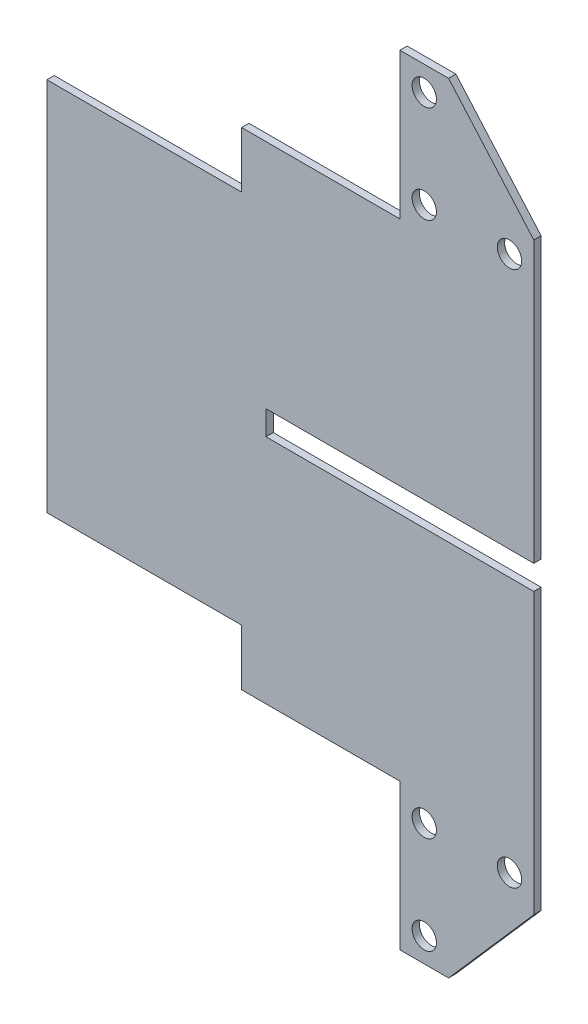
ISO-10303-21;
HEADER;
FILE_DESCRIPTION(('STEP AP214'),'2;1');
FILE_NAME('part.step','',(''),(''),'','','');
FILE_SCHEMA(('AUTOMOTIVE_DESIGN { 1 0 10303 214 1 1 1 1 }'));
ENDSEC;
DATA;
#1=APPLICATION_CONTEXT('core data for automotive mechanical design processes');
#2=APPLICATION_PROTOCOL_DEFINITION('international standard','automotive_design',2000,#1);
#3=PRODUCT_CONTEXT('',#1,'mechanical');
#4=PRODUCT('Part','Part','',(#3));
#5=PRODUCT_RELATED_PRODUCT_CATEGORY('part','',(#4));
#6=PRODUCT_DEFINITION_FORMATION('','',#4);
#7=PRODUCT_DEFINITION_CONTEXT('part definition',#1,'design');
#8=PRODUCT_DEFINITION('design','',#6,#7);
#9=PRODUCT_DEFINITION_SHAPE('','',#8);
#10=(LENGTH_UNIT() NAMED_UNIT(*) SI_UNIT(.MILLI.,.METRE.));
#11=(NAMED_UNIT(*) PLANE_ANGLE_UNIT() SI_UNIT($,.RADIAN.));
#12=(NAMED_UNIT(*) SI_UNIT($,.STERADIAN.) SOLID_ANGLE_UNIT());
#13=UNCERTAINTY_MEASURE_WITH_UNIT(LENGTH_MEASURE(1.E-05),#10,'distance_accuracy_value','');
#14=(GEOMETRIC_REPRESENTATION_CONTEXT(3) GLOBAL_UNCERTAINTY_ASSIGNED_CONTEXT((#13)) GLOBAL_UNIT_ASSIGNED_CONTEXT((#10,
#11,#12)) REPRESENTATION_CONTEXT('',''));
#15=CARTESIAN_POINT('',(0.,0.,0.));
#16=DIRECTION('',(0.,0.,1.));
#17=DIRECTION('',(1.,0.,0.));
#18=AXIS2_PLACEMENT_3D('',#15,#16,#17);
#19=CARTESIAN_POINT('',(0.,100.,3.));
#20=DIRECTION('',(0.,1.,0.));
#21=DIRECTION('',(0.,0.,1.));
#22=AXIS2_PLACEMENT_3D('',#19,#20,#21);
#23=PLANE('',#22);
#24=DIRECTION('',(1.,0.,0.));
#25=VECTOR('',#24,1.);
#26=CARTESIAN_POINT('',(0.,100.,0.));
#27=LINE('',#26,#25);
#28=CARTESIAN_POINT('',(80.,100.,0.));
#29=VERTEX_POINT('',#28);
#30=CARTESIAN_POINT('',(145.,100.,0.));
#31=VERTEX_POINT('',#30);
#32=EDGE_CURVE('E153',#29,#31,#27,.T.);
#33=ORIENTED_EDGE('',*,*,#32,.F.);
#34=DIRECTION('',(0.,0.,-1.));
#35=VECTOR('',#34,1.);
#36=CARTESIAN_POINT('',(80.,100.,3.));
#37=LINE('',#36,#35);
#38=CARTESIAN_POINT('',(80.,100.,3.));
#39=VERTEX_POINT('',#38);
#40=EDGE_CURVE('E11',#39,#29,#37,.T.);
#41=ORIENTED_EDGE('',*,*,#40,.F.);
#42=DIRECTION('',(1.,0.,0.));
#43=VECTOR('',#42,1.);
#44=CARTESIAN_POINT('',(0.,100.,3.));
#45=LINE('',#44,#43);
#46=CARTESIAN_POINT('',(145.,100.,3.));
#47=VERTEX_POINT('',#46);
#48=EDGE_CURVE('E189',#39,#47,#45,.T.);
#49=ORIENTED_EDGE('',*,*,#48,.T.);
#50=DIRECTION('',(0.,0.,-1.));
#51=VECTOR('',#50,1.);
#52=CARTESIAN_POINT('',(145.,100.,3.));
#53=LINE('',#52,#51);
#54=EDGE_CURVE('E53',#47,#31,#53,.T.);
#55=ORIENTED_EDGE('',*,*,#54,.T.);
#56=EDGE_LOOP('',(#33,#41,#49,#55));
#57=FACE_BOUND('',#56,.T.);
#58=ADVANCED_FACE('F37',(#57),#23,.T.);
#59=CARTESIAN_POINT('',(80.,0.,3.));
#60=DIRECTION('',(1.,0.,0.));
#61=DIRECTION('',(0.,0.,-1.));
#62=AXIS2_PLACEMENT_3D('',#59,#60,#61);
#63=PLANE('',#62);
#64=DIRECTION('',(0.,-1.,0.));
#65=VECTOR('',#64,1.);
#66=CARTESIAN_POINT('',(80.,0.,0.));
#67=LINE('',#66,#65);
#68=CARTESIAN_POINT('',(80.,77.,0.));
#69=VERTEX_POINT('',#68);
#70=EDGE_CURVE('E155',#29,#69,#67,.T.);
#71=ORIENTED_EDGE('',*,*,#70,.T.);
#72=DIRECTION('',(0.,0.,-1.));
#73=VECTOR('',#72,1.);
#74=CARTESIAN_POINT('',(80.,77.,3.));
#75=LINE('',#74,#73);
#76=CARTESIAN_POINT('',(80.,77.,3.));
#77=VERTEX_POINT('',#76);
#78=EDGE_CURVE('E45',#77,#69,#75,.T.);
#79=ORIENTED_EDGE('',*,*,#78,.F.);
#80=DIRECTION('',(0.,-1.,0.));
#81=VECTOR('',#80,1.);
#82=CARTESIAN_POINT('',(80.,0.,3.));
#83=LINE('',#82,#81);
#84=EDGE_CURVE('E258',#39,#77,#83,.T.);
#85=ORIENTED_EDGE('',*,*,#84,.F.);
#86=ORIENTED_EDGE('',*,*,#40,.T.);
#87=EDGE_LOOP('',(#71,#79,#85,#86));
#88=FACE_BOUND('',#87,.T.);
#89=ADVANCED_FACE('F207',(#88),#63,.F.);
#90=CARTESIAN_POINT('',(0.,77.,3.));
#91=DIRECTION('',(0.,1.,0.));
#92=DIRECTION('',(0.,0.,1.));
#93=AXIS2_PLACEMENT_3D('',#90,#91,#92);
#94=PLANE('',#93);
#95=DIRECTION('',(1.,0.,0.));
#96=VECTOR('',#95,1.);
#97=CARTESIAN_POINT('',(0.,77.,0.));
#98=LINE('',#97,#96);
#99=CARTESIAN_POINT('',(0.,77.,0.));
#100=VERTEX_POINT('',#99);
#101=EDGE_CURVE('E159',#100,#69,#98,.T.);
#102=ORIENTED_EDGE('',*,*,#101,.F.);
#103=DIRECTION('',(0.,0.,-1.));
#104=VECTOR('',#103,1.);
#105=CARTESIAN_POINT('',(0.,77.,3.));
#106=LINE('',#105,#104);
#107=CARTESIAN_POINT('',(0.,77.,3.));
#108=VERTEX_POINT('',#107);
#109=EDGE_CURVE('E197',#108,#100,#106,.T.);
#110=ORIENTED_EDGE('',*,*,#109,.F.);
#111=DIRECTION('',(1.,0.,0.));
#112=VECTOR('',#111,1.);
#113=CARTESIAN_POINT('',(0.,77.,3.));
#114=LINE('',#113,#112);
#115=EDGE_CURVE('E204',#108,#77,#114,.T.);
#116=ORIENTED_EDGE('',*,*,#115,.T.);
#117=ORIENTED_EDGE('',*,*,#78,.T.);
#118=EDGE_LOOP('',(#102,#110,#116,#117));
#119=FACE_BOUND('',#118,.T.);
#120=ADVANCED_FACE('F202',(#119),#94,.T.);
#121=CARTESIAN_POINT('',(0.,0.,3.));
#122=DIRECTION('',(1.,0.,0.));
#123=DIRECTION('',(0.,0.,-1.));
#124=AXIS2_PLACEMENT_3D('',#121,#122,#123);
#125=PLANE('',#124);
#126=DIRECTION('',(0.,-1.,0.));
#127=VECTOR('',#126,1.);
#128=CARTESIAN_POINT('',(0.,0.,0.));
#129=LINE('',#128,#127);
#130=CARTESIAN_POINT('',(0.,-77.,0.));
#131=VERTEX_POINT('',#130);
#132=EDGE_CURVE('E162',#100,#131,#129,.T.);
#133=ORIENTED_EDGE('',*,*,#132,.T.);
#134=DIRECTION('',(0.,0.,-1.));
#135=VECTOR('',#134,1.);
#136=CARTESIAN_POINT('',(0.,-77.,3.));
#137=LINE('',#136,#135);
#138=CARTESIAN_POINT('',(0.,-77.,3.));
#139=VERTEX_POINT('',#138);
#140=EDGE_CURVE('E223',#139,#131,#137,.T.);
#141=ORIENTED_EDGE('',*,*,#140,.F.);
#142=DIRECTION('',(0.,-1.,0.));
#143=VECTOR('',#142,1.);
#144=CARTESIAN_POINT('',(0.,0.,3.));
#145=LINE('',#144,#143);
#146=EDGE_CURVE('E261',#108,#139,#145,.T.);
#147=ORIENTED_EDGE('',*,*,#146,.F.);
#148=ORIENTED_EDGE('',*,*,#109,.T.);
#149=EDGE_LOOP('',(#133,#141,#147,#148));
#150=FACE_BOUND('',#149,.T.);
#151=ADVANCED_FACE('F220',(#150),#125,.F.);
#152=CARTESIAN_POINT('',(90.,2.4980018054066E-13,3.));
#153=DIRECTION('',(-1.,0.,0.));
#154=DIRECTION('',(0.,-1.,0.));
#155=AXIS2_PLACEMENT_3D('',#152,#153,#154);
#156=PLANE('',#155);
#157=DIRECTION('',(0.,1.,0.));
#158=VECTOR('',#157,1.);
#159=CARTESIAN_POINT('',(90.,2.4980018054066E-13,0.));
#160=LINE('',#159,#158);
#161=CARTESIAN_POINT('',(90.,-4.99999999999999,0.));
#162=VERTEX_POINT('',#161);
#163=CARTESIAN_POINT('',(90.,4.99999999999998,0.));
#164=VERTEX_POINT('',#163);
#165=EDGE_CURVE('E165',#162,#164,#160,.T.);
#166=ORIENTED_EDGE('',*,*,#165,.T.);
#167=DIRECTION('',(0.,0.,-1.));
#168=VECTOR('',#167,1.);
#169=CARTESIAN_POINT('',(90.,4.99999999999998,3.));
#170=LINE('',#169,#168);
#171=CARTESIAN_POINT('',(90.,4.99999999999998,3.));
#172=VERTEX_POINT('',#171);
#173=EDGE_CURVE('E195',#172,#164,#170,.T.);
#174=ORIENTED_EDGE('',*,*,#173,.F.);
#175=DIRECTION('',(0.,1.,0.));
#176=VECTOR('',#175,1.);
#177=CARTESIAN_POINT('',(90.,2.4980018054066E-13,3.));
#178=LINE('',#177,#176);
#179=CARTESIAN_POINT('',(90.,-4.99999999999999,3.));
#180=VERTEX_POINT('',#179);
#181=EDGE_CURVE('E264',#180,#172,#178,.T.);
#182=ORIENTED_EDGE('',*,*,#181,.F.);
#183=DIRECTION('',(0.,0.,-1.));
#184=VECTOR('',#183,1.);
#185=CARTESIAN_POINT('',(90.,-4.99999999999999,3.));
#186=LINE('',#185,#184);
#187=EDGE_CURVE('E233',#180,#162,#186,.T.);
#188=ORIENTED_EDGE('',*,*,#187,.T.);
#189=EDGE_LOOP('',(#166,#174,#182,#188));
#190=FACE_BOUND('',#189,.T.);
#191=ADVANCED_FACE('F301',(#190),#156,.F.);
#192=CARTESIAN_POINT('',(0.,4.99999999999997,3.));
#193=DIRECTION('',(0.,-1.,0.));
#194=DIRECTION('',(1.,0.,0.));
#195=AXIS2_PLACEMENT_3D('',#192,#193,#194);
#196=PLANE('',#195);
#197=DIRECTION('',(-1.,0.,0.));
#198=VECTOR('',#197,1.);
#199=CARTESIAN_POINT('',(0.,4.99999999999997,0.));
#200=LINE('',#199,#198);
#201=CARTESIAN_POINT('',(200.,5.,0.));
#202=VERTEX_POINT('',#201);
#203=EDGE_CURVE('E168',#202,#164,#200,.T.);
#204=ORIENTED_EDGE('',*,*,#203,.F.);
#205=DIRECTION('',(0.,0.,-1.));
#206=VECTOR('',#205,1.);
#207=CARTESIAN_POINT('',(200.,5.,3.));
#208=LINE('',#207,#206);
#209=CARTESIAN_POINT('',(200.,5.,3.));
#210=VERTEX_POINT('',#209);
#211=EDGE_CURVE('E193',#210,#202,#208,.T.);
#212=ORIENTED_EDGE('',*,*,#211,.F.);
#213=DIRECTION('',(-1.,0.,0.));
#214=VECTOR('',#213,1.);
#215=CARTESIAN_POINT('',(0.,4.99999999999997,3.));
#216=LINE('',#215,#214);
#217=EDGE_CURVE('E139',#210,#172,#216,.T.);
#218=ORIENTED_EDGE('',*,*,#217,.T.);
#219=ORIENTED_EDGE('',*,*,#173,.T.);
#220=EDGE_LOOP('',(#204,#212,#218,#219));
#221=FACE_BOUND('',#220,.T.);
#222=ADVANCED_FACE('F268',(#221),#196,.T.);
#223=CARTESIAN_POINT('',(200.,0.,3.));
#224=DIRECTION('',(1.,0.,0.));
#225=DIRECTION('',(0.,0.,-1.));
#226=AXIS2_PLACEMENT_3D('',#223,#224,#225);
#227=PLANE('',#226);
#228=DIRECTION('',(0.,-1.,0.));
#229=VECTOR('',#228,1.);
#230=CARTESIAN_POINT('',(200.,0.,0.));
#231=LINE('',#230,#229);
#232=CARTESIAN_POINT('',(200.,120.,0.));
#233=VERTEX_POINT('',#232);
#234=EDGE_CURVE('E171',#233,#202,#231,.T.);
#235=ORIENTED_EDGE('',*,*,#234,.F.);
#236=DIRECTION('',(0.,0.,-1.));
#237=VECTOR('',#236,1.);
#238=CARTESIAN_POINT('',(200.,120.,3.));
#239=LINE('',#238,#237);
#240=CARTESIAN_POINT('',(200.,120.,3.));
#241=VERTEX_POINT('',#240);
#242=EDGE_CURVE('E123',#241,#233,#239,.T.);
#243=ORIENTED_EDGE('',*,*,#242,.F.);
#244=DIRECTION('',(0.,-1.,0.));
#245=VECTOR('',#244,1.);
#246=CARTESIAN_POINT('',(200.,0.,3.));
#247=LINE('',#246,#245);
#248=EDGE_CURVE('E137',#241,#210,#247,.T.);
#249=ORIENTED_EDGE('',*,*,#248,.T.);
#250=ORIENTED_EDGE('',*,*,#211,.T.);
#251=EDGE_LOOP('',(#235,#243,#249,#250));
#252=FACE_BOUND('',#251,.T.);
#253=ADVANCED_FACE('F274',(#252),#227,.T.);
#254=CARTESIAN_POINT('',(172.743362831858,151.150442477876,3.));
#255=DIRECTION('',(0.752576694706877,0.658504607868518,0.));
#256=DIRECTION('',(-0.658504607868519,0.752576694706877,0.));
#257=AXIS2_PLACEMENT_3D('',#254,#255,#256);
#258=PLANE('',#257);
#259=DIRECTION('',(0.658504607868519,-0.752576694706877,0.));
#260=VECTOR('',#259,1.);
#261=CARTESIAN_POINT('',(172.743362831858,151.150442477876,0.));
#262=LINE('',#261,#260);
#263=CARTESIAN_POINT('',(165.,160.,0.));
#264=VERTEX_POINT('',#263);
#265=EDGE_CURVE('E120',#264,#233,#262,.T.);
#266=ORIENTED_EDGE('',*,*,#265,.F.);
#267=DIRECTION('',(0.,0.,-1.));
#268=VECTOR('',#267,1.);
#269=CARTESIAN_POINT('',(165.,160.,3.));
#270=LINE('',#269,#268);
#271=CARTESIAN_POINT('',(165.,160.,3.));
#272=VERTEX_POINT('',#271);
#273=EDGE_CURVE('E114',#272,#264,#270,.T.);
#274=ORIENTED_EDGE('',*,*,#273,.F.);
#275=DIRECTION('',(0.658504607868519,-0.752576694706877,0.));
#276=VECTOR('',#275,1.);
#277=CARTESIAN_POINT('',(172.743362831858,151.150442477876,3.));
#278=LINE('',#277,#276);
#279=EDGE_CURVE('E118',#272,#241,#278,.T.);
#280=ORIENTED_EDGE('',*,*,#279,.T.);
#281=ORIENTED_EDGE('',*,*,#242,.T.);
#282=EDGE_LOOP('',(#266,#274,#280,#281));
#283=FACE_BOUND('',#282,.T.);
#284=ADVANCED_FACE('F116',(#283),#258,.T.);
#285=CARTESIAN_POINT('',(0.,160.,3.));
#286=DIRECTION('',(0.,-1.,0.));
#287=DIRECTION('',(0.,0.,-1.));
#288=AXIS2_PLACEMENT_3D('',#285,#286,#287);
#289=PLANE('',#288);
#290=DIRECTION('',(-1.,0.,0.));
#291=VECTOR('',#290,1.);
#292=CARTESIAN_POINT('',(0.,160.,0.));
#293=LINE('',#292,#291);
#294=CARTESIAN_POINT('',(145.,160.,0.));
#295=VERTEX_POINT('',#294);
#296=EDGE_CURVE('E175',#264,#295,#293,.T.);
#297=ORIENTED_EDGE('',*,*,#296,.T.);
#298=DIRECTION('',(0.,0.,-1.));
#299=VECTOR('',#298,1.);
#300=CARTESIAN_POINT('',(145.,160.,3.));
#301=LINE('',#300,#299);
#302=CARTESIAN_POINT('',(145.,160.,3.));
#303=VERTEX_POINT('',#302);
#304=EDGE_CURVE('E83',#303,#295,#301,.T.);
#305=ORIENTED_EDGE('',*,*,#304,.F.);
#306=DIRECTION('',(-1.,0.,0.));
#307=VECTOR('',#306,1.);
#308=CARTESIAN_POINT('',(0.,160.,3.));
#309=LINE('',#308,#307);
#310=EDGE_CURVE('E125',#272,#303,#309,.T.);
#311=ORIENTED_EDGE('',*,*,#310,.F.);
#312=ORIENTED_EDGE('',*,*,#273,.T.);
#313=EDGE_LOOP('',(#297,#305,#311,#312));
#314=FACE_BOUND('',#313,.T.);
#315=ADVANCED_FACE('F126',(#314),#289,.F.);
#316=CARTESIAN_POINT('',(155.,150.,3.));
#317=DIRECTION('',(0.,0.,-1.));
#318=DIRECTION('',(-1.,0.,0.));
#319=AXIS2_PLACEMENT_3D('',#316,#317,#318);
#320=CYLINDRICAL_SURFACE('',#319,4.99999999999999);
#321=CARTESIAN_POINT('',(155.,150.,3.));
#322=DIRECTION('',(0.,0.,1.));
#323=DIRECTION('',(1.,0.,0.));
#324=AXIS2_PLACEMENT_3D('',#321,#322,#323);
#325=CIRCLE('',#324,4.99999999999999);
#326=CARTESIAN_POINT('',(160.,150.,3.));
#327=VERTEX_POINT('',#326);
#328=EDGE_CURVE('E147',#327,#327,#325,.T.);
#329=ORIENTED_EDGE('',*,*,#328,.T.);
#330=EDGE_LOOP('',(#329));
#331=FACE_BOUND('',#330,.T.);
#332=CARTESIAN_POINT('',(155.,150.,0.));
#333=DIRECTION('',(0.,0.,1.));
#334=DIRECTION('',(1.,0.,0.));
#335=AXIS2_PLACEMENT_3D('',#332,#333,#334);
#336=CIRCLE('',#335,4.99999999999999);
#337=CARTESIAN_POINT('',(160.,150.,0.));
#338=VERTEX_POINT('',#337);
#339=EDGE_CURVE('E183',#338,#338,#336,.T.);
#340=ORIENTED_EDGE('',*,*,#339,.F.);
#341=EDGE_LOOP('',(#340));
#342=FACE_BOUND('',#341,.T.);
#343=ADVANCED_FACE('F286',(#331,#342),#320,.F.);
#344=CARTESIAN_POINT('',(155.,110.,3.));
#345=DIRECTION('',(0.,0.,-1.));
#346=DIRECTION('',(-1.,0.,0.));
#347=AXIS2_PLACEMENT_3D('',#344,#345,#346);
#348=CYLINDRICAL_SURFACE('',#347,4.99999999999999);
#349=CARTESIAN_POINT('',(155.,110.,3.));
#350=DIRECTION('',(0.,0.,1.));
#351=DIRECTION('',(1.,0.,0.));
#352=AXIS2_PLACEMENT_3D('',#349,#350,#351);
#353=CIRCLE('',#352,4.99999999999999);
#354=CARTESIAN_POINT('',(160.,110.,3.));
#355=VERTEX_POINT('',#354);
#356=EDGE_CURVE('E144',#355,#355,#353,.T.);
#357=ORIENTED_EDGE('',*,*,#356,.T.);
#358=EDGE_LOOP('',(#357));
#359=FACE_BOUND('',#358,.T.);
#360=CARTESIAN_POINT('',(155.,110.,0.));
#361=DIRECTION('',(0.,0.,1.));
#362=DIRECTION('',(1.,0.,0.));
#363=AXIS2_PLACEMENT_3D('',#360,#361,#362);
#364=CIRCLE('',#363,4.99999999999999);
#365=CARTESIAN_POINT('',(160.,110.,0.));
#366=VERTEX_POINT('',#365);
#367=EDGE_CURVE('E180',#366,#366,#364,.T.);
#368=ORIENTED_EDGE('',*,*,#367,.F.);
#369=EDGE_LOOP('',(#368));
#370=FACE_BOUND('',#369,.T.);
#371=ADVANCED_FACE('F278',(#359,#370),#348,.F.);
#372=CARTESIAN_POINT('',(145.,0.,3.));
#373=DIRECTION('',(-1.,0.,0.));
#374=DIRECTION('',(0.,0.,1.));
#375=AXIS2_PLACEMENT_3D('',#372,#373,#374);
#376=PLANE('',#375);
#377=DIRECTION('',(0.,1.,0.));
#378=VECTOR('',#377,1.);
#379=CARTESIAN_POINT('',(145.,0.,0.));
#380=LINE('',#379,#378);
#381=EDGE_CURVE('E177',#31,#295,#380,.T.);
#382=ORIENTED_EDGE('',*,*,#381,.F.);
#383=ORIENTED_EDGE('',*,*,#54,.F.);
#384=DIRECTION('',(0.,1.,0.));
#385=VECTOR('',#384,1.);
#386=CARTESIAN_POINT('',(145.,0.,3.));
#387=LINE('',#386,#385);
#388=EDGE_CURVE('E129',#47,#303,#387,.T.);
#389=ORIENTED_EDGE('',*,*,#388,.T.);
#390=ORIENTED_EDGE('',*,*,#304,.T.);
#391=EDGE_LOOP('',(#382,#383,#389,#390));
#392=FACE_BOUND('',#391,.T.);
#393=ADVANCED_FACE('F275',(#392),#376,.T.);
#394=CARTESIAN_POINT('',(190.,110.,3.));
#395=DIRECTION('',(0.,0.,-1.));
#396=DIRECTION('',(-1.,0.,0.));
#397=AXIS2_PLACEMENT_3D('',#394,#395,#396);
#398=CYLINDRICAL_SURFACE('',#397,4.99999999999999);
#399=CARTESIAN_POINT('',(190.,110.,3.));
#400=DIRECTION('',(0.,0.,1.));
#401=DIRECTION('',(1.,0.,0.));
#402=AXIS2_PLACEMENT_3D('',#399,#400,#401);
#403=CIRCLE('',#402,4.99999999999999);
#404=CARTESIAN_POINT('',(195.,110.,3.));
#405=VERTEX_POINT('',#404);
#406=EDGE_CURVE('E150',#405,#405,#403,.T.);
#407=ORIENTED_EDGE('',*,*,#406,.T.);
#408=EDGE_LOOP('',(#407));
#409=FACE_BOUND('',#408,.T.);
#410=CARTESIAN_POINT('',(190.,110.,0.));
#411=DIRECTION('',(0.,0.,1.));
#412=DIRECTION('',(1.,0.,0.));
#413=AXIS2_PLACEMENT_3D('',#410,#411,#412);
#414=CIRCLE('',#413,4.99999999999999);
#415=CARTESIAN_POINT('',(195.,110.,0.));
#416=VERTEX_POINT('',#415);
#417=EDGE_CURVE('E186',#416,#416,#414,.T.);
#418=ORIENTED_EDGE('',*,*,#417,.F.);
#419=EDGE_LOOP('',(#418));
#420=FACE_BOUND('',#419,.T.);
#421=ADVANCED_FACE('F277',(#409,#420),#398,.F.);
#422=CARTESIAN_POINT('',(0.,0.,3.));
#423=DIRECTION('',(0.,0.,1.));
#424=DIRECTION('',(1.,0.,0.));
#425=AXIS2_PLACEMENT_3D('',#422,#423,#424);
#426=PLANE('',#425);
#427=ORIENTED_EDGE('',*,*,#48,.F.);
#428=ORIENTED_EDGE('',*,*,#84,.T.);
#429=ORIENTED_EDGE('',*,*,#115,.F.);
#430=ORIENTED_EDGE('',*,*,#146,.T.);
#431=DIRECTION('',(1.,0.,0.));
#432=VECTOR('',#431,1.);
#433=CARTESIAN_POINT('',(0.,-77.,3.));
#434=LINE('',#433,#432);
#435=CARTESIAN_POINT('',(80.,-77.,3.));
#436=VERTEX_POINT('',#435);
#437=EDGE_CURVE('E232',#139,#436,#434,.T.);
#438=ORIENTED_EDGE('',*,*,#437,.T.);
#439=DIRECTION('',(0.,1.,0.));
#440=VECTOR('',#439,1.);
#441=CARTESIAN_POINT('',(80.,0.,3.));
#442=LINE('',#441,#440);
#443=CARTESIAN_POINT('',(80.,-100.,3.));
#444=VERTEX_POINT('',#443);
#445=EDGE_CURVE('E478',#444,#436,#442,.T.);
#446=ORIENTED_EDGE('',*,*,#445,.F.);
#447=DIRECTION('',(1.,0.,0.));
#448=VECTOR('',#447,1.);
#449=CARTESIAN_POINT('',(0.,-100.,3.));
#450=LINE('',#449,#448);
#451=CARTESIAN_POINT('',(145.,-100.,3.));
#452=VERTEX_POINT('',#451);
#453=EDGE_CURVE('E375',#444,#452,#450,.T.);
#454=ORIENTED_EDGE('',*,*,#453,.T.);
#455=DIRECTION('',(0.,-1.,0.));
#456=VECTOR('',#455,1.);
#457=CARTESIAN_POINT('',(145.,0.,3.));
#458=LINE('',#457,#456);
#459=CARTESIAN_POINT('',(145.,-160.,3.));
#460=VERTEX_POINT('',#459);
#461=EDGE_CURVE('E379',#452,#460,#458,.T.);
#462=ORIENTED_EDGE('',*,*,#461,.T.);
#463=DIRECTION('',(-1.,0.,0.));
#464=VECTOR('',#463,1.);
#465=CARTESIAN_POINT('',(0.,-160.,3.));
#466=LINE('',#465,#464);
#467=CARTESIAN_POINT('',(165.,-160.,3.));
#468=VERTEX_POINT('',#467);
#469=EDGE_CURVE('E475',#468,#460,#466,.T.);
#470=ORIENTED_EDGE('',*,*,#469,.F.);
#471=DIRECTION('',(0.658504607868519,0.752576694706877,0.));
#472=VECTOR('',#471,1.);
#473=CARTESIAN_POINT('',(172.743362831858,-151.150442477876,3.));
#474=LINE('',#473,#472);
#475=CARTESIAN_POINT('',(200.,-120.,3.));
#476=VERTEX_POINT('',#475);
#477=EDGE_CURVE('E485',#468,#476,#474,.T.);
#478=ORIENTED_EDGE('',*,*,#477,.T.);
#479=DIRECTION('',(0.,1.,0.));
#480=VECTOR('',#479,1.);
#481=CARTESIAN_POINT('',(200.,0.,3.));
#482=LINE('',#481,#480);
#483=CARTESIAN_POINT('',(200.,-5.,3.));
#484=VERTEX_POINT('',#483);
#485=EDGE_CURVE('E468',#476,#484,#482,.T.);
#486=ORIENTED_EDGE('',*,*,#485,.T.);
#487=DIRECTION('',(-1.,0.,0.));
#488=VECTOR('',#487,1.);
#489=CARTESIAN_POINT('',(0.,-4.99999999999997,3.));
#490=LINE('',#489,#488);
#491=EDGE_CURVE('E466',#484,#180,#490,.T.);
#492=ORIENTED_EDGE('',*,*,#491,.T.);
#493=ORIENTED_EDGE('',*,*,#181,.T.);
#494=ORIENTED_EDGE('',*,*,#217,.F.);
#495=ORIENTED_EDGE('',*,*,#248,.F.);
#496=ORIENTED_EDGE('',*,*,#279,.F.);
#497=ORIENTED_EDGE('',*,*,#310,.T.);
#498=ORIENTED_EDGE('',*,*,#388,.F.);
#499=EDGE_LOOP('',(#427,#428,#429,#430,#438,#446,#454,#462,#470,#478,#486,#492,#493,#494,#495,
#496,#497,#498));
#500=FACE_BOUND('',#499,.T.);
#501=ORIENTED_EDGE('',*,*,#356,.F.);
#502=EDGE_LOOP('',(#501));
#503=FACE_BOUND('',#502,.T.);
#504=ORIENTED_EDGE('',*,*,#328,.F.);
#505=EDGE_LOOP('',(#504));
#506=FACE_BOUND('',#505,.T.);
#507=ORIENTED_EDGE('',*,*,#406,.F.);
#508=EDGE_LOOP('',(#507));
#509=FACE_BOUND('',#508,.T.);
#510=CARTESIAN_POINT('',(155.,-110.,3.));
#511=DIRECTION('',(0.,0.,-1.));
#512=DIRECTION('',(1.,0.,0.));
#513=AXIS2_PLACEMENT_3D('',#510,#511,#512);
#514=CIRCLE('',#513,4.99999999999999);
#515=CARTESIAN_POINT('',(160.,-110.,3.));
#516=VERTEX_POINT('',#515);
#517=EDGE_CURVE('E394',#516,#516,#514,.T.);
#518=ORIENTED_EDGE('',*,*,#517,.T.);
#519=EDGE_LOOP('',(#518));
#520=FACE_BOUND('',#519,.T.);
#521=CARTESIAN_POINT('',(155.,-150.,3.));
#522=DIRECTION('',(0.,0.,-1.));
#523=DIRECTION('',(1.,0.,0.));
#524=AXIS2_PLACEMENT_3D('',#521,#522,#523);
#525=CIRCLE('',#524,4.99999999999999);
#526=CARTESIAN_POINT('',(160.,-150.,3.));
#527=VERTEX_POINT('',#526);
#528=EDGE_CURVE('E390',#527,#527,#525,.T.);
#529=ORIENTED_EDGE('',*,*,#528,.T.);
#530=EDGE_LOOP('',(#529));
#531=FACE_BOUND('',#530,.T.);
#532=CARTESIAN_POINT('',(190.,-110.,3.));
#533=DIRECTION('',(0.,0.,-1.));
#534=DIRECTION('',(1.,0.,0.));
#535=AXIS2_PLACEMENT_3D('',#532,#533,#534);
#536=CIRCLE('',#535,4.99999999999999);
#537=CARTESIAN_POINT('',(195.,-110.,3.));
#538=VERTEX_POINT('',#537);
#539=EDGE_CURVE('E370',#538,#538,#536,.T.);
#540=ORIENTED_EDGE('',*,*,#539,.T.);
#541=EDGE_LOOP('',(#540));
#542=FACE_BOUND('',#541,.T.);
#543=ADVANCED_FACE('F133',(#500,#503,#506,#509,#520,#531,#542),#426,.T.);
#544=CARTESIAN_POINT('',(0.,0.,0.));
#545=DIRECTION('',(0.,0.,1.));
#546=DIRECTION('',(1.,0.,0.));
#547=AXIS2_PLACEMENT_3D('',#544,#545,#546);
#548=PLANE('',#547);
#549=ORIENTED_EDGE('',*,*,#32,.T.);
#550=ORIENTED_EDGE('',*,*,#381,.T.);
#551=ORIENTED_EDGE('',*,*,#296,.F.);
#552=ORIENTED_EDGE('',*,*,#265,.T.);
#553=ORIENTED_EDGE('',*,*,#234,.T.);
#554=ORIENTED_EDGE('',*,*,#203,.T.);
#555=ORIENTED_EDGE('',*,*,#165,.F.);
#556=DIRECTION('',(-1.,0.,0.));
#557=VECTOR('',#556,1.);
#558=CARTESIAN_POINT('',(0.,-4.99999999999997,0.));
#559=LINE('',#558,#557);
#560=CARTESIAN_POINT('',(200.,-5.,0.));
#561=VERTEX_POINT('',#560);
#562=EDGE_CURVE('E412',#561,#162,#559,.T.);
#563=ORIENTED_EDGE('',*,*,#562,.F.);
#564=DIRECTION('',(0.,1.,0.));
#565=VECTOR('',#564,1.);
#566=CARTESIAN_POINT('',(200.,0.,0.));
#567=LINE('',#566,#565);
#568=CARTESIAN_POINT('',(200.,-120.,0.));
#569=VERTEX_POINT('',#568);
#570=EDGE_CURVE('E409',#569,#561,#567,.T.);
#571=ORIENTED_EDGE('',*,*,#570,.F.);
#572=DIRECTION('',(0.658504607868519,0.752576694706877,0.));
#573=VECTOR('',#572,1.);
#574=CARTESIAN_POINT('',(172.743362831858,-151.150442477876,0.));
#575=LINE('',#574,#573);
#576=CARTESIAN_POINT('',(165.,-160.,0.));
#577=VERTEX_POINT('',#576);
#578=EDGE_CURVE('E406',#577,#569,#575,.T.);
#579=ORIENTED_EDGE('',*,*,#578,.F.);
#580=DIRECTION('',(-1.,0.,0.));
#581=VECTOR('',#580,1.);
#582=CARTESIAN_POINT('',(0.,-160.,0.));
#583=LINE('',#582,#581);
#584=CARTESIAN_POINT('',(145.,-160.,0.));
#585=VERTEX_POINT('',#584);
#586=EDGE_CURVE('E403',#577,#585,#583,.T.);
#587=ORIENTED_EDGE('',*,*,#586,.T.);
#588=DIRECTION('',(0.,-1.,0.));
#589=VECTOR('',#588,1.);
#590=CARTESIAN_POINT('',(145.,0.,0.));
#591=LINE('',#590,#589);
#592=CARTESIAN_POINT('',(145.,-100.,0.));
#593=VERTEX_POINT('',#592);
#594=EDGE_CURVE('E400',#593,#585,#591,.T.);
#595=ORIENTED_EDGE('',*,*,#594,.F.);
#596=DIRECTION('',(1.,0.,0.));
#597=VECTOR('',#596,1.);
#598=CARTESIAN_POINT('',(0.,-100.,0.));
#599=LINE('',#598,#597);
#600=CARTESIAN_POINT('',(80.,-100.,0.));
#601=VERTEX_POINT('',#600);
#602=EDGE_CURVE('E398',#601,#593,#599,.T.);
#603=ORIENTED_EDGE('',*,*,#602,.F.);
#604=DIRECTION('',(0.,1.,0.));
#605=VECTOR('',#604,1.);
#606=CARTESIAN_POINT('',(80.,0.,0.));
#607=LINE('',#606,#605);
#608=CARTESIAN_POINT('',(80.,-77.,0.));
#609=VERTEX_POINT('',#608);
#610=EDGE_CURVE('E416',#601,#609,#607,.T.);
#611=ORIENTED_EDGE('',*,*,#610,.T.);
#612=DIRECTION('',(1.,0.,0.));
#613=VECTOR('',#612,1.);
#614=CARTESIAN_POINT('',(0.,-77.,0.));
#615=LINE('',#614,#613);
#616=EDGE_CURVE('E216',#131,#609,#615,.T.);
#617=ORIENTED_EDGE('',*,*,#616,.F.);
#618=ORIENTED_EDGE('',*,*,#132,.F.);
#619=ORIENTED_EDGE('',*,*,#101,.T.);
#620=ORIENTED_EDGE('',*,*,#70,.F.);
#621=EDGE_LOOP('',(#549,#550,#551,#552,#553,#554,#555,#563,#571,#579,#587,#595,#603,#611,#617,
#618,#619,#620));
#622=FACE_BOUND('',#621,.T.);
#623=ORIENTED_EDGE('',*,*,#367,.T.);
#624=EDGE_LOOP('',(#623));
#625=FACE_BOUND('',#624,.T.);
#626=ORIENTED_EDGE('',*,*,#339,.T.);
#627=EDGE_LOOP('',(#626));
#628=FACE_BOUND('',#627,.T.);
#629=ORIENTED_EDGE('',*,*,#417,.T.);
#630=EDGE_LOOP('',(#629));
#631=FACE_BOUND('',#630,.T.);
#632=CARTESIAN_POINT('',(155.,-110.,0.));
#633=DIRECTION('',(0.,0.,-1.));
#634=DIRECTION('',(1.,0.,0.));
#635=AXIS2_PLACEMENT_3D('',#632,#633,#634);
#636=CIRCLE('',#635,4.99999999999999);
#637=CARTESIAN_POINT('',(160.,-110.,0.));
#638=VERTEX_POINT('',#637);
#639=EDGE_CURVE('E382',#638,#638,#636,.T.);
#640=ORIENTED_EDGE('',*,*,#639,.F.);
#641=EDGE_LOOP('',(#640));
#642=FACE_BOUND('',#641,.T.);
#643=CARTESIAN_POINT('',(155.,-150.,0.));
#644=DIRECTION('',(0.,0.,-1.));
#645=DIRECTION('',(1.,0.,0.));
#646=AXIS2_PLACEMENT_3D('',#643,#644,#645);
#647=CIRCLE('',#646,4.99999999999999);
#648=CARTESIAN_POINT('',(160.,-150.,0.));
#649=VERTEX_POINT('',#648);
#650=EDGE_CURVE('E376',#649,#649,#647,.T.);
#651=ORIENTED_EDGE('',*,*,#650,.F.);
#652=EDGE_LOOP('',(#651));
#653=FACE_BOUND('',#652,.T.);
#654=CARTESIAN_POINT('',(190.,-110.,0.));
#655=DIRECTION('',(0.,0.,-1.));
#656=DIRECTION('',(1.,0.,0.));
#657=AXIS2_PLACEMENT_3D('',#654,#655,#656);
#658=CIRCLE('',#657,4.99999999999999);
#659=CARTESIAN_POINT('',(195.,-110.,0.));
#660=VERTEX_POINT('',#659);
#661=EDGE_CURVE('E373',#660,#660,#658,.T.);
#662=ORIENTED_EDGE('',*,*,#661,.F.);
#663=EDGE_LOOP('',(#662));
#664=FACE_BOUND('',#663,.T.);
#665=ADVANCED_FACE('F210',(#622,#625,#628,#631,#642,#653,#664),#548,.F.);
#666=CARTESIAN_POINT('',(0.,-100.,3.));
#667=DIRECTION('',(0.,1.,0.));
#668=DIRECTION('',(-1.,0.,0.));
#669=AXIS2_PLACEMENT_3D('',#666,#667,#668);
#670=PLANE('',#669);
#671=ORIENTED_EDGE('',*,*,#602,.T.);
#672=DIRECTION('',(0.,0.,-1.));
#673=VECTOR('',#672,1.);
#674=CARTESIAN_POINT('',(145.,-100.,3.));
#675=LINE('',#674,#673);
#676=EDGE_CURVE('E156',#452,#593,#675,.T.);
#677=ORIENTED_EDGE('',*,*,#676,.F.);
#678=ORIENTED_EDGE('',*,*,#453,.F.);
#679=DIRECTION('',(0.,0.,-1.));
#680=VECTOR('',#679,1.);
#681=CARTESIAN_POINT('',(80.,-100.,3.));
#682=LINE('',#681,#680);
#683=EDGE_CURVE('E240',#444,#601,#682,.T.);
#684=ORIENTED_EDGE('',*,*,#683,.T.);
#685=EDGE_LOOP('',(#671,#677,#678,#684));
#686=FACE_BOUND('',#685,.T.);
#687=ADVANCED_FACE('F322',(#686),#670,.F.);
#688=CARTESIAN_POINT('',(145.,0.,3.));
#689=DIRECTION('',(1.,0.,0.));
#690=DIRECTION('',(0.,1.,0.));
#691=AXIS2_PLACEMENT_3D('',#688,#689,#690);
#692=PLANE('',#691);
#693=ORIENTED_EDGE('',*,*,#594,.T.);
#694=DIRECTION('',(0.,0.,-1.));
#695=VECTOR('',#694,1.);
#696=CARTESIAN_POINT('',(145.,-160.,3.));
#697=LINE('',#696,#695);
#698=EDGE_CURVE('E252',#460,#585,#697,.T.);
#699=ORIENTED_EDGE('',*,*,#698,.F.);
#700=ORIENTED_EDGE('',*,*,#461,.F.);
#701=ORIENTED_EDGE('',*,*,#676,.T.);
#702=EDGE_LOOP('',(#693,#699,#700,#701));
#703=FACE_BOUND('',#702,.T.);
#704=ADVANCED_FACE('F327',(#703),#692,.F.);
#705=CARTESIAN_POINT('',(0.,-160.,3.));
#706=DIRECTION('',(0.,-1.,0.));
#707=DIRECTION('',(1.,0.,0.));
#708=AXIS2_PLACEMENT_3D('',#705,#706,#707);
#709=PLANE('',#708);
#710=ORIENTED_EDGE('',*,*,#586,.F.);
#711=DIRECTION('',(0.,0.,-1.));
#712=VECTOR('',#711,1.);
#713=CARTESIAN_POINT('',(165.,-160.,3.));
#714=LINE('',#713,#712);
#715=EDGE_CURVE('E249',#468,#577,#714,.T.);
#716=ORIENTED_EDGE('',*,*,#715,.F.);
#717=ORIENTED_EDGE('',*,*,#469,.T.);
#718=ORIENTED_EDGE('',*,*,#698,.T.);
#719=EDGE_LOOP('',(#710,#716,#717,#718));
#720=FACE_BOUND('',#719,.T.);
#721=ADVANCED_FACE('F331',(#720),#709,.T.);
#722=CARTESIAN_POINT('',(172.743362831858,-151.150442477876,3.));
#723=DIRECTION('',(-0.752576694706877,0.658504607868518,0.));
#724=DIRECTION('',(-0.658504607868519,-0.752576694706877,0.));
#725=AXIS2_PLACEMENT_3D('',#722,#723,#724);
#726=PLANE('',#725);
#727=ORIENTED_EDGE('',*,*,#578,.T.);
#728=DIRECTION('',(0.,0.,-1.));
#729=VECTOR('',#728,1.);
#730=CARTESIAN_POINT('',(200.,-120.,3.));
#731=LINE('',#730,#729);
#732=EDGE_CURVE('E246',#476,#569,#731,.T.);
#733=ORIENTED_EDGE('',*,*,#732,.F.);
#734=ORIENTED_EDGE('',*,*,#477,.F.);
#735=ORIENTED_EDGE('',*,*,#715,.T.);
#736=EDGE_LOOP('',(#727,#733,#734,#735));
#737=FACE_BOUND('',#736,.T.);
#738=ADVANCED_FACE('F335',(#737),#726,.F.);
#739=CARTESIAN_POINT('',(200.,0.,3.));
#740=DIRECTION('',(-1.,0.,0.));
#741=DIRECTION('',(0.,-1.,0.));
#742=AXIS2_PLACEMENT_3D('',#739,#740,#741);
#743=PLANE('',#742);
#744=ORIENTED_EDGE('',*,*,#570,.T.);
#745=DIRECTION('',(0.,0.,-1.));
#746=VECTOR('',#745,1.);
#747=CARTESIAN_POINT('',(200.,-5.,3.));
#748=LINE('',#747,#746);
#749=EDGE_CURVE('E237',#484,#561,#748,.T.);
#750=ORIENTED_EDGE('',*,*,#749,.F.);
#751=ORIENTED_EDGE('',*,*,#485,.F.);
#752=ORIENTED_EDGE('',*,*,#732,.T.);
#753=EDGE_LOOP('',(#744,#750,#751,#752));
#754=FACE_BOUND('',#753,.T.);
#755=ADVANCED_FACE('F339',(#754),#743,.F.);
#756=CARTESIAN_POINT('',(0.,-4.99999999999997,3.));
#757=DIRECTION('',(0.,-1.,0.));
#758=DIRECTION('',(1.,0.,0.));
#759=AXIS2_PLACEMENT_3D('',#756,#757,#758);
#760=PLANE('',#759);
#761=ORIENTED_EDGE('',*,*,#562,.T.);
#762=ORIENTED_EDGE('',*,*,#187,.F.);
#763=ORIENTED_EDGE('',*,*,#491,.F.);
#764=ORIENTED_EDGE('',*,*,#749,.T.);
#765=EDGE_LOOP('',(#761,#762,#763,#764));
#766=FACE_BOUND('',#765,.T.);
#767=ADVANCED_FACE('F343',(#766),#760,.F.);
#768=CARTESIAN_POINT('',(0.,-77.,3.));
#769=DIRECTION('',(0.,1.,0.));
#770=DIRECTION('',(-1.,0.,0.));
#771=AXIS2_PLACEMENT_3D('',#768,#769,#770);
#772=PLANE('',#771);
#773=ORIENTED_EDGE('',*,*,#616,.T.);
#774=DIRECTION('',(0.,0.,-1.));
#775=VECTOR('',#774,1.);
#776=CARTESIAN_POINT('',(80.,-77.,3.));
#777=LINE('',#776,#775);
#778=EDGE_CURVE('E234',#436,#609,#777,.T.);
#779=ORIENTED_EDGE('',*,*,#778,.F.);
#780=ORIENTED_EDGE('',*,*,#437,.F.);
#781=ORIENTED_EDGE('',*,*,#140,.T.);
#782=EDGE_LOOP('',(#773,#779,#780,#781));
#783=FACE_BOUND('',#782,.T.);
#784=ADVANCED_FACE('F229',(#783),#772,.F.);
#785=CARTESIAN_POINT('',(155.,-150.,3.));
#786=DIRECTION('',(0.,0.,-1.));
#787=DIRECTION('',(-1.,0.,0.));
#788=AXIS2_PLACEMENT_3D('',#785,#786,#787);
#789=CYLINDRICAL_SURFACE('',#788,4.99999999999999);
#790=ORIENTED_EDGE('',*,*,#528,.F.);
#791=EDGE_LOOP('',(#790));
#792=FACE_BOUND('',#791,.T.);
#793=ORIENTED_EDGE('',*,*,#650,.T.);
#794=EDGE_LOOP('',(#793));
#795=FACE_BOUND('',#794,.T.);
#796=ADVANCED_FACE('F350',(#792,#795),#789,.F.);
#797=CARTESIAN_POINT('',(155.,-110.,3.));
#798=DIRECTION('',(0.,0.,-1.));
#799=DIRECTION('',(-1.,0.,0.));
#800=AXIS2_PLACEMENT_3D('',#797,#798,#799);
#801=CYLINDRICAL_SURFACE('',#800,4.99999999999999);
#802=ORIENTED_EDGE('',*,*,#517,.F.);
#803=EDGE_LOOP('',(#802));
#804=FACE_BOUND('',#803,.T.);
#805=ORIENTED_EDGE('',*,*,#639,.T.);
#806=EDGE_LOOP('',(#805));
#807=FACE_BOUND('',#806,.T.);
#808=ADVANCED_FACE('F355',(#804,#807),#801,.F.);
#809=CARTESIAN_POINT('',(80.,0.,3.));
#810=DIRECTION('',(-1.,0.,0.));
#811=DIRECTION('',(0.,-1.,0.));
#812=AXIS2_PLACEMENT_3D('',#809,#810,#811);
#813=PLANE('',#812);
#814=ORIENTED_EDGE('',*,*,#610,.F.);
#815=ORIENTED_EDGE('',*,*,#683,.F.);
#816=ORIENTED_EDGE('',*,*,#445,.T.);
#817=ORIENTED_EDGE('',*,*,#778,.T.);
#818=EDGE_LOOP('',(#814,#815,#816,#817));
#819=FACE_BOUND('',#818,.T.);
#820=ADVANCED_FACE('F351',(#819),#813,.T.);
#821=CARTESIAN_POINT('',(190.,-110.,3.));
#822=DIRECTION('',(0.,0.,-1.));
#823=DIRECTION('',(-1.,0.,0.));
#824=AXIS2_PLACEMENT_3D('',#821,#822,#823);
#825=CYLINDRICAL_SURFACE('',#824,4.99999999999999);
#826=ORIENTED_EDGE('',*,*,#539,.F.);
#827=EDGE_LOOP('',(#826));
#828=FACE_BOUND('',#827,.T.);
#829=ORIENTED_EDGE('',*,*,#661,.T.);
#830=EDGE_LOOP('',(#829));
#831=FACE_BOUND('',#830,.T.);
#832=ADVANCED_FACE('F354',(#828,#831),#825,.F.);
#833=CLOSED_SHELL('',(#58,#89,#120,#151,#191,#222,#253,#284,#315,#343,#371,#393,#421,#543,#665,
#687,#704,#721,#738,#755,#767,#784,#796,#808,#820,#832));
#834=MANIFOLD_SOLID_BREP('B2',#833);
#835=ADVANCED_BREP_SHAPE_REPRESENTATION('',(#18,#834),#14);
#836=SHAPE_DEFINITION_REPRESENTATION(#9,#835);
ENDSEC;
END-ISO-10303-21;
